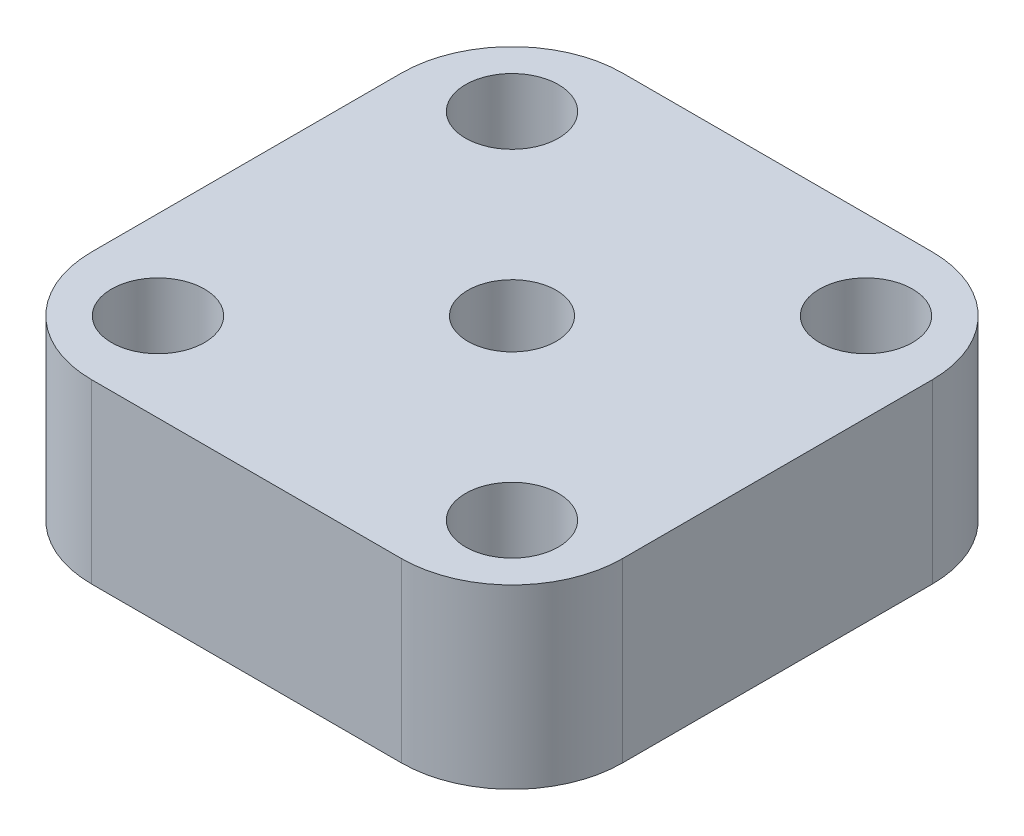
ISO-10303-21;
HEADER;
FILE_DESCRIPTION(('STEP AP214'),'2;1');
FILE_NAME('part.step','',(''),(''),'','','');
FILE_SCHEMA(('AUTOMOTIVE_DESIGN { 1 0 10303 214 1 1 1 1 }'));
ENDSEC;
DATA;
#1=APPLICATION_CONTEXT('core data for automotive mechanical design processes');
#2=APPLICATION_PROTOCOL_DEFINITION('international standard','automotive_design',2000,#1);
#3=PRODUCT_CONTEXT('',#1,'mechanical');
#4=PRODUCT('Part','Part','',(#3));
#5=PRODUCT_RELATED_PRODUCT_CATEGORY('part','',(#4));
#6=PRODUCT_DEFINITION_FORMATION('','',#4);
#7=PRODUCT_DEFINITION_CONTEXT('part definition',#1,'design');
#8=PRODUCT_DEFINITION('design','',#6,#7);
#9=PRODUCT_DEFINITION_SHAPE('','',#8);
#10=(LENGTH_UNIT() NAMED_UNIT(*) SI_UNIT(.MILLI.,.METRE.));
#11=(NAMED_UNIT(*) PLANE_ANGLE_UNIT() SI_UNIT($,.RADIAN.));
#12=(NAMED_UNIT(*) SI_UNIT($,.STERADIAN.) SOLID_ANGLE_UNIT());
#13=UNCERTAINTY_MEASURE_WITH_UNIT(LENGTH_MEASURE(1.E-05),#10,'distance_accuracy_value','');
#14=(GEOMETRIC_REPRESENTATION_CONTEXT(3) GLOBAL_UNCERTAINTY_ASSIGNED_CONTEXT((#13)) GLOBAL_UNIT_ASSIGNED_CONTEXT((#10,
#11,#12)) REPRESENTATION_CONTEXT('',''));
#15=CARTESIAN_POINT('',(0.,0.,0.));
#16=DIRECTION('',(0.,0.,1.));
#17=DIRECTION('',(1.,0.,0.));
#18=AXIS2_PLACEMENT_3D('',#15,#16,#17);
#19=CARTESIAN_POINT('',(19.,8.,-19.));
#20=DIRECTION('',(0.,-1.,0.));
#21=DIRECTION('',(0.,0.,-1.));
#22=AXIS2_PLACEMENT_3D('',#19,#20,#21);
#23=PLANE('',#22);
#24=CARTESIAN_POINT('',(12.,8.,-12.));
#25=DIRECTION('',(0.,-1.,0.));
#26=DIRECTION('',(0.,0.,-1.));
#27=AXIS2_PLACEMENT_3D('',#24,#25,#26);
#28=CIRCLE('',#27,2.);
#29=CARTESIAN_POINT('',(12.,8.,-14.));
#30=VERTEX_POINT('',#29);
#31=EDGE_CURVE('E142',#30,#30,#28,.T.);
#32=ORIENTED_EDGE('',*,*,#31,.T.);
#33=EDGE_LOOP('',(#32));
#34=FACE_BOUND('',#33,.T.);
#35=CARTESIAN_POINT('',(4.00000000000017,8.,-4.));
#36=DIRECTION('',(0.,-1.,0.));
#37=DIRECTION('',(0.,0.,-1.));
#38=AXIS2_PLACEMENT_3D('',#35,#36,#37);
#39=CIRCLE('',#38,2.1);
#40=CARTESIAN_POINT('',(4.00000000000017,8.,-6.1));
#41=VERTEX_POINT('',#40);
#42=EDGE_CURVE('E20',#41,#41,#39,.T.);
#43=ORIENTED_EDGE('',*,*,#42,.T.);
#44=EDGE_LOOP('',(#43));
#45=FACE_BOUND('',#44,.T.);
#46=CARTESIAN_POINT('',(20.0000000000002,8.,-4.));
#47=DIRECTION('',(0.,-1.,0.));
#48=DIRECTION('',(0.,0.,-1.));
#49=AXIS2_PLACEMENT_3D('',#46,#47,#48);
#50=CIRCLE('',#49,2.1);
#51=CARTESIAN_POINT('',(20.0000000000002,8.,-6.1));
#52=VERTEX_POINT('',#51);
#53=EDGE_CURVE('E145',#52,#52,#50,.T.);
#54=ORIENTED_EDGE('',*,*,#53,.T.);
#55=EDGE_LOOP('',(#54));
#56=FACE_BOUND('',#55,.T.);
#57=CARTESIAN_POINT('',(20.,8.,-20.));
#58=DIRECTION('',(0.,-1.,0.));
#59=DIRECTION('',(0.,0.,-1.));
#60=AXIS2_PLACEMENT_3D('',#57,#58,#59);
#61=CIRCLE('',#60,2.1);
#62=CARTESIAN_POINT('',(20.,8.,-22.1));
#63=VERTEX_POINT('',#62);
#64=EDGE_CURVE('E89',#63,#63,#61,.T.);
#65=ORIENTED_EDGE('',*,*,#64,.T.);
#66=EDGE_LOOP('',(#65));
#67=FACE_BOUND('',#66,.T.);
#68=CARTESIAN_POINT('',(4.,8.,-20.));
#69=DIRECTION('',(0.,-1.,0.));
#70=DIRECTION('',(0.,0.,-1.));
#71=AXIS2_PLACEMENT_3D('',#68,#69,#70);
#72=CIRCLE('',#71,2.1);
#73=CARTESIAN_POINT('',(4.,8.,-22.1));
#74=VERTEX_POINT('',#73);
#75=EDGE_CURVE('E102',#74,#74,#72,.T.);
#76=ORIENTED_EDGE('',*,*,#75,.T.);
#77=EDGE_LOOP('',(#76));
#78=FACE_BOUND('',#77,.T.);
#79=DIRECTION('',(1.,0.,0.));
#80=VECTOR('',#79,1.);
#81=CARTESIAN_POINT('',(5.00000000000004,8.,-24.));
#82=LINE('',#81,#80);
#83=CARTESIAN_POINT('',(19.,8.,-24.));
#84=VERTEX_POINT('',#83);
#85=CARTESIAN_POINT('',(5.00000000000002,8.,-24.));
#86=VERTEX_POINT('',#85);
#87=EDGE_CURVE('E84',#84,#86,#82,.F.);
#88=ORIENTED_EDGE('',*,*,#87,.T.);
#89=CARTESIAN_POINT('',(5.,8.,-19.));
#90=DIRECTION('',(0.,-1.,0.));
#91=DIRECTION('',(0.,0.,-1.));
#92=AXIS2_PLACEMENT_3D('',#89,#90,#91);
#93=CIRCLE('',#92,5.);
#94=CARTESIAN_POINT('',(0.,8.,-19.));
#95=VERTEX_POINT('',#94);
#96=EDGE_CURVE('E98',#95,#86,#93,.T.);
#97=ORIENTED_EDGE('',*,*,#96,.F.);
#98=DIRECTION('',(0.,0.,-1.));
#99=VECTOR('',#98,1.);
#100=CARTESIAN_POINT('',(0.,8.,-5.00000000000004));
#101=LINE('',#100,#99);
#102=CARTESIAN_POINT('',(0.,8.,-5.00000000000002));
#103=VERTEX_POINT('',#102);
#104=EDGE_CURVE('E108',#95,#103,#101,.F.);
#105=ORIENTED_EDGE('',*,*,#104,.T.);
#106=CARTESIAN_POINT('',(5.,8.,-5.));
#107=DIRECTION('',(0.,-1.,0.));
#108=DIRECTION('',(0.,0.,-1.));
#109=AXIS2_PLACEMENT_3D('',#106,#107,#108);
#110=CIRCLE('',#109,5.);
#111=CARTESIAN_POINT('',(5.00000000000002,8.,0.));
#112=VERTEX_POINT('',#111);
#113=EDGE_CURVE('E111',#112,#103,#110,.T.);
#114=ORIENTED_EDGE('',*,*,#113,.F.);
#115=DIRECTION('',(-1.,0.,0.));
#116=VECTOR('',#115,1.);
#117=CARTESIAN_POINT('',(5.00000000000004,8.,0.));
#118=LINE('',#117,#116);
#119=CARTESIAN_POINT('',(19.,8.,0.));
#120=VERTEX_POINT('',#119);
#121=EDGE_CURVE('E112',#112,#120,#118,.F.);
#122=ORIENTED_EDGE('',*,*,#121,.T.);
#123=CARTESIAN_POINT('',(19.,8.,-5.));
#124=DIRECTION('',(0.,-1.,0.));
#125=DIRECTION('',(0.,0.,-1.));
#126=AXIS2_PLACEMENT_3D('',#123,#124,#125);
#127=CIRCLE('',#126,5.);
#128=CARTESIAN_POINT('',(24.,8.,-5.00000000000002));
#129=VERTEX_POINT('',#128);
#130=EDGE_CURVE('E115',#129,#120,#127,.T.);
#131=ORIENTED_EDGE('',*,*,#130,.F.);
#132=DIRECTION('',(0.,0.,1.));
#133=VECTOR('',#132,1.);
#134=CARTESIAN_POINT('',(24.,8.,-5.00000000000004));
#135=LINE('',#134,#133);
#136=CARTESIAN_POINT('',(24.,8.,-19.));
#137=VERTEX_POINT('',#136);
#138=EDGE_CURVE('E86',#129,#137,#135,.F.);
#139=ORIENTED_EDGE('',*,*,#138,.T.);
#140=CARTESIAN_POINT('',(19.,8.,-19.));
#141=DIRECTION('',(0.,-1.,0.));
#142=DIRECTION('',(0.,0.,-1.));
#143=AXIS2_PLACEMENT_3D('',#140,#141,#142);
#144=CIRCLE('',#143,5.);
#145=EDGE_CURVE('E80',#84,#137,#144,.T.);
#146=ORIENTED_EDGE('',*,*,#145,.F.);
#147=EDGE_LOOP('',(#88,#97,#105,#114,#122,#131,#139,#146));
#148=FACE_BOUND('',#147,.T.);
#149=ADVANCED_FACE('F17',(#34,#45,#56,#67,#78,#148),#23,.F.);
#150=CARTESIAN_POINT('',(4.00000000000017,8.,-4.));
#151=DIRECTION('',(0.,-1.,0.));
#152=DIRECTION('',(0.,0.,-1.));
#153=AXIS2_PLACEMENT_3D('',#150,#151,#152);
#154=CYLINDRICAL_SURFACE('',#153,2.1);
#155=ORIENTED_EDGE('',*,*,#42,.F.);
#156=EDGE_LOOP('',(#155));
#157=FACE_BOUND('',#156,.T.);
#158=CARTESIAN_POINT('',(4.00000000000017,0.,-4.));
#159=DIRECTION('',(0.,-1.,0.));
#160=DIRECTION('',(0.,0.,-1.));
#161=AXIS2_PLACEMENT_3D('',#158,#159,#160);
#162=CIRCLE('',#161,2.1);
#163=CARTESIAN_POINT('',(4.00000000000017,0.,-6.1));
#164=VERTEX_POINT('',#163);
#165=EDGE_CURVE('E139',#164,#164,#162,.F.);
#166=ORIENTED_EDGE('',*,*,#165,.F.);
#167=EDGE_LOOP('',(#166));
#168=FACE_BOUND('',#167,.T.);
#169=ADVANCED_FACE('F165',(#157,#168),#154,.F.);
#170=CARTESIAN_POINT('',(20.,8.,-20.));
#171=DIRECTION('',(0.,-1.,0.));
#172=DIRECTION('',(0.,0.,-1.));
#173=AXIS2_PLACEMENT_3D('',#170,#171,#172);
#174=CYLINDRICAL_SURFACE('',#173,2.1);
#175=ORIENTED_EDGE('',*,*,#64,.F.);
#176=EDGE_LOOP('',(#175));
#177=FACE_BOUND('',#176,.T.);
#178=CARTESIAN_POINT('',(20.,0.,-20.));
#179=DIRECTION('',(0.,-1.,0.));
#180=DIRECTION('',(0.,0.,-1.));
#181=AXIS2_PLACEMENT_3D('',#178,#179,#180);
#182=CIRCLE('',#181,2.1);
#183=CARTESIAN_POINT('',(20.,0.,-22.1));
#184=VERTEX_POINT('',#183);
#185=EDGE_CURVE('E136',#184,#184,#182,.F.);
#186=ORIENTED_EDGE('',*,*,#185,.F.);
#187=EDGE_LOOP('',(#186));
#188=FACE_BOUND('',#187,.T.);
#189=ADVANCED_FACE('F168',(#177,#188),#174,.F.);
#190=CARTESIAN_POINT('',(19.,8.,-19.));
#191=DIRECTION('',(0.,-1.,0.));
#192=DIRECTION('',(0.,0.,-1.));
#193=AXIS2_PLACEMENT_3D('',#190,#191,#192);
#194=CYLINDRICAL_SURFACE('',#193,5.);
#195=ORIENTED_EDGE('',*,*,#145,.T.);
#196=DIRECTION('',(0.,1.,0.));
#197=VECTOR('',#196,1.);
#198=CARTESIAN_POINT('',(24.,8.,-19.));
#199=LINE('',#198,#197);
#200=CARTESIAN_POINT('',(24.,0.,-19.));
#201=VERTEX_POINT('',#200);
#202=EDGE_CURVE('E106',#137,#201,#199,.F.);
#203=ORIENTED_EDGE('',*,*,#202,.T.);
#204=CARTESIAN_POINT('',(19.,0.,-19.));
#205=DIRECTION('',(0.,-1.,0.));
#206=DIRECTION('',(0.,0.,-1.));
#207=AXIS2_PLACEMENT_3D('',#204,#205,#206);
#208=CIRCLE('',#207,5.);
#209=CARTESIAN_POINT('',(19.,0.,-24.));
#210=VERTEX_POINT('',#209);
#211=EDGE_CURVE('E95',#210,#201,#208,.T.);
#212=ORIENTED_EDGE('',*,*,#211,.F.);
#213=DIRECTION('',(0.,1.,0.));
#214=VECTOR('',#213,1.);
#215=CARTESIAN_POINT('',(19.,8.,-24.));
#216=LINE('',#215,#214);
#217=EDGE_CURVE('E92',#210,#84,#216,.T.);
#218=ORIENTED_EDGE('',*,*,#217,.T.);
#219=EDGE_LOOP('',(#195,#203,#212,#218));
#220=FACE_BOUND('',#219,.T.);
#221=ADVANCED_FACE('F93',(#220),#194,.T.);
#222=CARTESIAN_POINT('',(24.,8.,-5.00000000000004));
#223=DIRECTION('',(-1.,0.,0.));
#224=DIRECTION('',(0.,0.,1.));
#225=AXIS2_PLACEMENT_3D('',#222,#223,#224);
#226=PLANE('',#225);
#227=ORIENTED_EDGE('',*,*,#202,.F.);
#228=ORIENTED_EDGE('',*,*,#138,.F.);
#229=DIRECTION('',(0.,-1.,0.));
#230=VECTOR('',#229,1.);
#231=CARTESIAN_POINT('',(24.,8.,-5.00000000000004));
#232=LINE('',#231,#230);
#233=CARTESIAN_POINT('',(24.,0.,-5.00000000000002));
#234=VERTEX_POINT('',#233);
#235=EDGE_CURVE('E156',#234,#129,#232,.F.);
#236=ORIENTED_EDGE('',*,*,#235,.F.);
#237=DIRECTION('',(0.,0.,-1.));
#238=VECTOR('',#237,1.);
#239=CARTESIAN_POINT('',(24.,0.,-19.));
#240=LINE('',#239,#238);
#241=EDGE_CURVE('E134',#201,#234,#240,.F.);
#242=ORIENTED_EDGE('',*,*,#241,.F.);
#243=EDGE_LOOP('',(#227,#228,#236,#242));
#244=FACE_BOUND('',#243,.T.);
#245=ADVANCED_FACE('F212',(#244),#226,.F.);
#246=CARTESIAN_POINT('',(19.,8.,-5.));
#247=DIRECTION('',(0.,-1.,0.));
#248=DIRECTION('',(0.,0.,-1.));
#249=AXIS2_PLACEMENT_3D('',#246,#247,#248);
#250=CYLINDRICAL_SURFACE('',#249,5.);
#251=ORIENTED_EDGE('',*,*,#130,.T.);
#252=DIRECTION('',(0.,1.,0.));
#253=VECTOR('',#252,1.);
#254=CARTESIAN_POINT('',(19.,8.,0.));
#255=LINE('',#254,#253);
#256=CARTESIAN_POINT('',(19.,0.,0.));
#257=VERTEX_POINT('',#256);
#258=EDGE_CURVE('E114',#120,#257,#255,.F.);
#259=ORIENTED_EDGE('',*,*,#258,.T.);
#260=CARTESIAN_POINT('',(19.,0.,-5.));
#261=DIRECTION('',(0.,-1.,0.));
#262=DIRECTION('',(0.,0.,-1.));
#263=AXIS2_PLACEMENT_3D('',#260,#261,#262);
#264=CIRCLE('',#263,5.);
#265=EDGE_CURVE('E131',#234,#257,#264,.T.);
#266=ORIENTED_EDGE('',*,*,#265,.F.);
#267=ORIENTED_EDGE('',*,*,#235,.T.);
#268=EDGE_LOOP('',(#251,#259,#266,#267));
#269=FACE_BOUND('',#268,.T.);
#270=ADVANCED_FACE('F208',(#269),#250,.T.);
#271=CARTESIAN_POINT('',(5.00000000000004,8.,0.));
#272=DIRECTION('',(0.,0.,-1.));
#273=DIRECTION('',(-1.,0.,0.));
#274=AXIS2_PLACEMENT_3D('',#271,#272,#273);
#275=PLANE('',#274);
#276=ORIENTED_EDGE('',*,*,#258,.F.);
#277=ORIENTED_EDGE('',*,*,#121,.F.);
#278=DIRECTION('',(0.,-1.,0.));
#279=VECTOR('',#278,1.);
#280=CARTESIAN_POINT('',(5.00000000000004,8.,0.));
#281=LINE('',#280,#279);
#282=CARTESIAN_POINT('',(5.00000000000002,0.,0.));
#283=VERTEX_POINT('',#282);
#284=EDGE_CURVE('E154',#283,#112,#281,.F.);
#285=ORIENTED_EDGE('',*,*,#284,.F.);
#286=DIRECTION('',(1.,0.,0.));
#287=VECTOR('',#286,1.);
#288=CARTESIAN_POINT('',(19.,0.,0.));
#289=LINE('',#288,#287);
#290=EDGE_CURVE('E130',#257,#283,#289,.F.);
#291=ORIENTED_EDGE('',*,*,#290,.F.);
#292=EDGE_LOOP('',(#276,#277,#285,#291));
#293=FACE_BOUND('',#292,.T.);
#294=ADVANCED_FACE('F204',(#293),#275,.F.);
#295=CARTESIAN_POINT('',(5.,8.,-5.));
#296=DIRECTION('',(0.,-1.,0.));
#297=DIRECTION('',(0.,0.,-1.));
#298=AXIS2_PLACEMENT_3D('',#295,#296,#297);
#299=CYLINDRICAL_SURFACE('',#298,5.);
#300=ORIENTED_EDGE('',*,*,#113,.T.);
#301=DIRECTION('',(0.,1.,0.));
#302=VECTOR('',#301,1.);
#303=CARTESIAN_POINT('',(0.,8.,-5.00000000000004));
#304=LINE('',#303,#302);
#305=CARTESIAN_POINT('',(0.,0.,-5.00000000000002));
#306=VERTEX_POINT('',#305);
#307=EDGE_CURVE('E110',#103,#306,#304,.F.);
#308=ORIENTED_EDGE('',*,*,#307,.T.);
#309=CARTESIAN_POINT('',(5.,0.,-5.));
#310=DIRECTION('',(0.,-1.,0.));
#311=DIRECTION('',(0.,0.,-1.));
#312=AXIS2_PLACEMENT_3D('',#309,#310,#311);
#313=CIRCLE('',#312,5.);
#314=EDGE_CURVE('E127',#283,#306,#313,.T.);
#315=ORIENTED_EDGE('',*,*,#314,.F.);
#316=ORIENTED_EDGE('',*,*,#284,.T.);
#317=EDGE_LOOP('',(#300,#308,#315,#316));
#318=FACE_BOUND('',#317,.T.);
#319=ADVANCED_FACE('F200',(#318),#299,.T.);
#320=CARTESIAN_POINT('',(0.,8.,-5.00000000000004));
#321=DIRECTION('',(1.,0.,0.));
#322=DIRECTION('',(0.,0.,-1.));
#323=AXIS2_PLACEMENT_3D('',#320,#321,#322);
#324=PLANE('',#323);
#325=ORIENTED_EDGE('',*,*,#307,.F.);
#326=ORIENTED_EDGE('',*,*,#104,.F.);
#327=DIRECTION('',(0.,-1.,0.));
#328=VECTOR('',#327,1.);
#329=CARTESIAN_POINT('',(0.,8.,-19.));
#330=LINE('',#329,#328);
#331=CARTESIAN_POINT('',(0.,0.,-19.));
#332=VERTEX_POINT('',#331);
#333=EDGE_CURVE('E151',#332,#95,#330,.F.);
#334=ORIENTED_EDGE('',*,*,#333,.F.);
#335=DIRECTION('',(0.,0.,-1.));
#336=VECTOR('',#335,1.);
#337=CARTESIAN_POINT('',(0.,0.,-19.));
#338=LINE('',#337,#336);
#339=EDGE_CURVE('E126',#306,#332,#338,.T.);
#340=ORIENTED_EDGE('',*,*,#339,.F.);
#341=EDGE_LOOP('',(#325,#326,#334,#340));
#342=FACE_BOUND('',#341,.T.);
#343=ADVANCED_FACE('F197',(#342),#324,.F.);
#344=CARTESIAN_POINT('',(5.,8.,-19.));
#345=DIRECTION('',(0.,-1.,0.));
#346=DIRECTION('',(0.,0.,-1.));
#347=AXIS2_PLACEMENT_3D('',#344,#345,#346);
#348=CYLINDRICAL_SURFACE('',#347,5.);
#349=ORIENTED_EDGE('',*,*,#96,.T.);
#350=DIRECTION('',(0.,1.,0.));
#351=VECTOR('',#350,1.);
#352=CARTESIAN_POINT('',(5.00000000000004,8.,-24.));
#353=LINE('',#352,#351);
#354=CARTESIAN_POINT('',(5.00000000000002,0.,-24.));
#355=VERTEX_POINT('',#354);
#356=EDGE_CURVE('E35',#86,#355,#353,.F.);
#357=ORIENTED_EDGE('',*,*,#356,.T.);
#358=CARTESIAN_POINT('',(5.,0.,-19.));
#359=DIRECTION('',(0.,-1.,0.));
#360=DIRECTION('',(0.,0.,-1.));
#361=AXIS2_PLACEMENT_3D('',#358,#359,#360);
#362=CIRCLE('',#361,5.);
#363=EDGE_CURVE('E123',#332,#355,#362,.T.);
#364=ORIENTED_EDGE('',*,*,#363,.F.);
#365=ORIENTED_EDGE('',*,*,#333,.T.);
#366=EDGE_LOOP('',(#349,#357,#364,#365));
#367=FACE_BOUND('',#366,.T.);
#368=ADVANCED_FACE('F194',(#367),#348,.T.);
#369=CARTESIAN_POINT('',(5.00000000000004,8.,-24.));
#370=DIRECTION('',(0.,0.,1.));
#371=DIRECTION('',(1.,0.,0.));
#372=AXIS2_PLACEMENT_3D('',#369,#370,#371);
#373=PLANE('',#372);
#374=ORIENTED_EDGE('',*,*,#356,.F.);
#375=ORIENTED_EDGE('',*,*,#87,.F.);
#376=ORIENTED_EDGE('',*,*,#217,.F.);
#377=DIRECTION('',(1.,0.,0.));
#378=VECTOR('',#377,1.);
#379=CARTESIAN_POINT('',(19.,0.,-24.));
#380=LINE('',#379,#378);
#381=EDGE_CURVE('E122',#355,#210,#380,.T.);
#382=ORIENTED_EDGE('',*,*,#381,.F.);
#383=EDGE_LOOP('',(#374,#375,#376,#382));
#384=FACE_BOUND('',#383,.T.);
#385=ADVANCED_FACE('F100',(#384),#373,.F.);
#386=CARTESIAN_POINT('',(4.,8.,-20.));
#387=DIRECTION('',(0.,-1.,0.));
#388=DIRECTION('',(0.,0.,-1.));
#389=AXIS2_PLACEMENT_3D('',#386,#387,#388);
#390=CYLINDRICAL_SURFACE('',#389,2.1);
#391=ORIENTED_EDGE('',*,*,#75,.F.);
#392=EDGE_LOOP('',(#391));
#393=FACE_BOUND('',#392,.T.);
#394=CARTESIAN_POINT('',(4.,0.,-20.));
#395=DIRECTION('',(0.,-1.,0.));
#396=DIRECTION('',(0.,0.,-1.));
#397=AXIS2_PLACEMENT_3D('',#394,#395,#396);
#398=CIRCLE('',#397,2.1);
#399=CARTESIAN_POINT('',(4.,0.,-22.1));
#400=VERTEX_POINT('',#399);
#401=EDGE_CURVE('E119',#400,#400,#398,.F.);
#402=ORIENTED_EDGE('',*,*,#401,.F.);
#403=EDGE_LOOP('',(#402));
#404=FACE_BOUND('',#403,.T.);
#405=ADVANCED_FACE('F187',(#393,#404),#390,.F.);
#406=CARTESIAN_POINT('',(20.0000000000002,8.,-4.));
#407=DIRECTION('',(0.,-1.,0.));
#408=DIRECTION('',(0.,0.,-1.));
#409=AXIS2_PLACEMENT_3D('',#406,#407,#408);
#410=CYLINDRICAL_SURFACE('',#409,2.1);
#411=ORIENTED_EDGE('',*,*,#53,.F.);
#412=EDGE_LOOP('',(#411));
#413=FACE_BOUND('',#412,.T.);
#414=CARTESIAN_POINT('',(20.0000000000002,0.,-4.));
#415=DIRECTION('',(0.,-1.,0.));
#416=DIRECTION('',(0.,0.,-1.));
#417=AXIS2_PLACEMENT_3D('',#414,#415,#416);
#418=CIRCLE('',#417,2.1);
#419=CARTESIAN_POINT('',(20.0000000000002,0.,-6.1));
#420=VERTEX_POINT('',#419);
#421=EDGE_CURVE('E26',#420,#420,#418,.F.);
#422=ORIENTED_EDGE('',*,*,#421,.F.);
#423=EDGE_LOOP('',(#422));
#424=FACE_BOUND('',#423,.T.);
#425=ADVANCED_FACE('F180',(#413,#424),#410,.F.);
#426=CARTESIAN_POINT('',(12.,8.,-12.));
#427=DIRECTION('',(0.,-1.,0.));
#428=DIRECTION('',(0.,0.,-1.));
#429=AXIS2_PLACEMENT_3D('',#426,#427,#428);
#430=CYLINDRICAL_SURFACE('',#429,2.);
#431=ORIENTED_EDGE('',*,*,#31,.F.);
#432=EDGE_LOOP('',(#431));
#433=FACE_BOUND('',#432,.T.);
#434=CARTESIAN_POINT('',(12.,0.,-12.));
#435=DIRECTION('',(0.,-1.,0.));
#436=DIRECTION('',(0.,0.,-1.));
#437=AXIS2_PLACEMENT_3D('',#434,#435,#436);
#438=CIRCLE('',#437,2.);
#439=CARTESIAN_POINT('',(12.,0.,-14.));
#440=VERTEX_POINT('',#439);
#441=EDGE_CURVE('E10',#440,#440,#438,.F.);
#442=ORIENTED_EDGE('',*,*,#441,.F.);
#443=EDGE_LOOP('',(#442));
#444=FACE_BOUND('',#443,.T.);
#445=ADVANCED_FACE('F173',(#433,#444),#430,.F.);
#446=CARTESIAN_POINT('',(19.,0.,-19.));
#447=DIRECTION('',(0.,-1.,0.));
#448=DIRECTION('',(0.,0.,-1.));
#449=AXIS2_PLACEMENT_3D('',#446,#447,#448);
#450=PLANE('',#449);
#451=ORIENTED_EDGE('',*,*,#441,.T.);
#452=EDGE_LOOP('',(#451));
#453=FACE_BOUND('',#452,.T.);
#454=ORIENTED_EDGE('',*,*,#421,.T.);
#455=EDGE_LOOP('',(#454));
#456=FACE_BOUND('',#455,.T.);
#457=ORIENTED_EDGE('',*,*,#401,.T.);
#458=EDGE_LOOP('',(#457));
#459=FACE_BOUND('',#458,.T.);
#460=ORIENTED_EDGE('',*,*,#363,.T.);
#461=ORIENTED_EDGE('',*,*,#381,.T.);
#462=ORIENTED_EDGE('',*,*,#211,.T.);
#463=ORIENTED_EDGE('',*,*,#241,.T.);
#464=ORIENTED_EDGE('',*,*,#265,.T.);
#465=ORIENTED_EDGE('',*,*,#290,.T.);
#466=ORIENTED_EDGE('',*,*,#314,.T.);
#467=ORIENTED_EDGE('',*,*,#339,.T.);
#468=EDGE_LOOP('',(#460,#461,#462,#463,#464,#465,#466,#467));
#469=FACE_BOUND('',#468,.T.);
#470=ORIENTED_EDGE('',*,*,#185,.T.);
#471=EDGE_LOOP('',(#470));
#472=FACE_BOUND('',#471,.T.);
#473=ORIENTED_EDGE('',*,*,#165,.T.);
#474=EDGE_LOOP('',(#473));
#475=FACE_BOUND('',#474,.T.);
#476=ADVANCED_FACE('F171',(#453,#456,#459,#469,#472,#475),#450,.T.);
#477=CLOSED_SHELL('',(#149,#169,#189,#221,#245,#270,#294,#319,#343,#368,#385,#405,#425,#445,#476));
#478=MANIFOLD_SOLID_BREP('B1',#477);
#479=ADVANCED_BREP_SHAPE_REPRESENTATION('',(#18,#478),#14);
#480=SHAPE_DEFINITION_REPRESENTATION(#9,#479);
ENDSEC;
END-ISO-10303-21;
